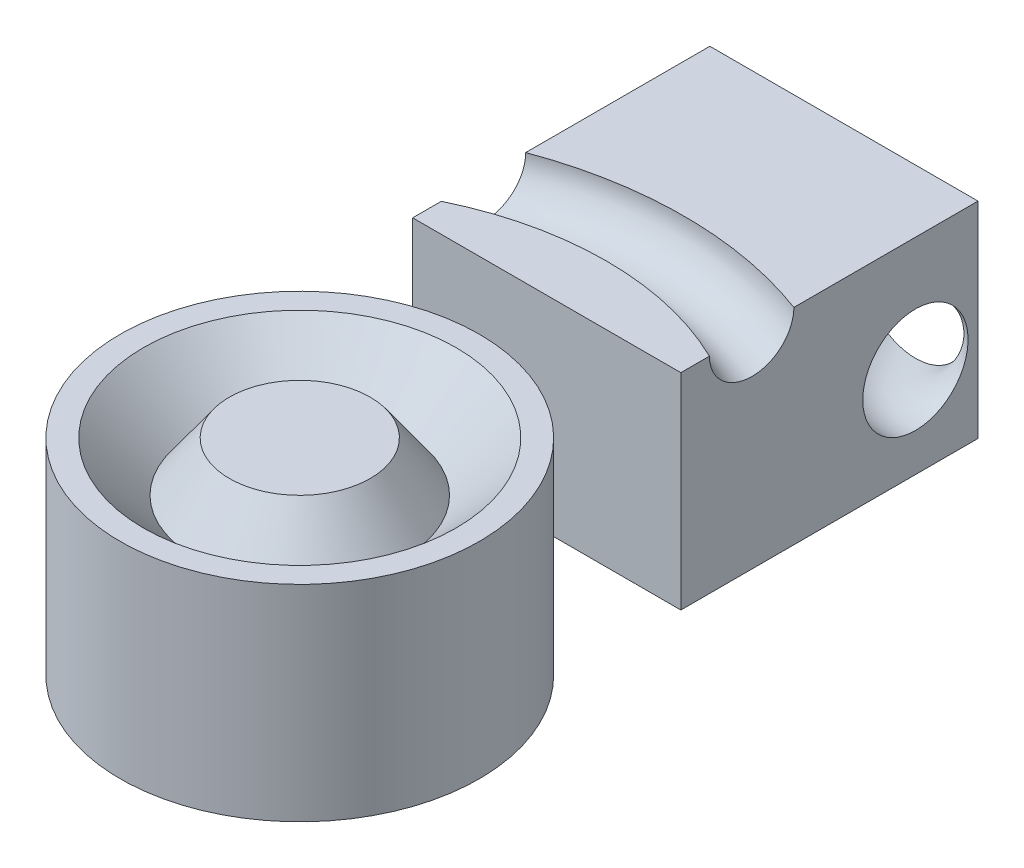
ISO-10303-21;
HEADER;
FILE_DESCRIPTION(('STEP AP214'),'2;1');
FILE_NAME('part.step','',(''),(''),'','','');
FILE_SCHEMA(('AUTOMOTIVE_DESIGN { 1 0 10303 214 1 1 1 1 }'));
ENDSEC;
DATA;
#1=APPLICATION_CONTEXT('core data for automotive mechanical design processes');
#2=APPLICATION_PROTOCOL_DEFINITION('international standard','automotive_design',2000,#1);
#3=PRODUCT_CONTEXT('',#1,'mechanical');
#4=PRODUCT('Part','Part','',(#3));
#5=PRODUCT_RELATED_PRODUCT_CATEGORY('part','',(#4));
#6=PRODUCT_DEFINITION_FORMATION('','',#4);
#7=PRODUCT_DEFINITION_CONTEXT('part definition',#1,'design');
#8=PRODUCT_DEFINITION('design','',#6,#7);
#9=PRODUCT_DEFINITION_SHAPE('','',#8);
#10=(LENGTH_UNIT() NAMED_UNIT(*) SI_UNIT(.MILLI.,.METRE.));
#11=(NAMED_UNIT(*) PLANE_ANGLE_UNIT() SI_UNIT($,.RADIAN.));
#12=(NAMED_UNIT(*) SI_UNIT($,.STERADIAN.) SOLID_ANGLE_UNIT());
#13=UNCERTAINTY_MEASURE_WITH_UNIT(LENGTH_MEASURE(1.E-05),#10,'distance_accuracy_value','');
#14=(GEOMETRIC_REPRESENTATION_CONTEXT(3) GLOBAL_UNCERTAINTY_ASSIGNED_CONTEXT((#13)) GLOBAL_UNIT_ASSIGNED_CONTEXT((#10,
#11,#12)) REPRESENTATION_CONTEXT('',''));
#15=CARTESIAN_POINT('',(0.,0.,0.));
#16=DIRECTION('',(0.,0.,1.));
#17=DIRECTION('',(1.,0.,0.));
#18=AXIS2_PLACEMENT_3D('',#15,#16,#17);
#19=CARTESIAN_POINT('',(0.,67.2092550326107,0.));
#20=DIRECTION('',(0.,1.,0.));
#21=DIRECTION('',(0.,0.,1.));
#22=AXIS2_PLACEMENT_3D('',#19,#20,#21);
#23=PLANE('',#22);
#24=CARTESIAN_POINT('',(0.,67.2092550326107,0.));
#25=DIRECTION('',(0.,1.,0.));
#26=DIRECTION('',(0.,0.,1.));
#27=AXIS2_PLACEMENT_3D('',#24,#25,#26);
#28=CIRCLE('',#27,125.577766247815);
#29=CARTESIAN_POINT('',(43.830339722009,67.2092550326387,-117.680400643625));
#30=VERTEX_POINT('',#29);
#31=CARTESIAN_POINT('',(-43.830339722009,67.2092550325985,-117.680400643625));
#32=VERTEX_POINT('',#31);
#33=EDGE_CURVE('E12',#30,#32,#28,.T.);
#34=ORIENTED_EDGE('',*,*,#33,.F.);
#35=DIRECTION('',(0.,0.,-1.));
#36=VECTOR('',#35,1.);
#37=CARTESIAN_POINT('',(43.830339722009,67.2092550326107,-177.866757769681));
#38=LINE('',#37,#36);
#39=CARTESIAN_POINT('',(43.830339722009,67.2092550326107,-177.866757769681));
#40=VERTEX_POINT('',#39);
#41=EDGE_CURVE('E109',#30,#40,#38,.T.);
#42=ORIENTED_EDGE('',*,*,#41,.T.);
#43=DIRECTION('',(-1.,0.,0.));
#44=VECTOR('',#43,1.);
#45=CARTESIAN_POINT('',(-43.830339722009,67.2092550326107,-177.866757769681));
#46=LINE('',#45,#44);
#47=CARTESIAN_POINT('',(-43.830339722009,67.2092550326107,-177.866757769681));
#48=VERTEX_POINT('',#47);
#49=EDGE_CURVE('E126',#40,#48,#46,.T.);
#50=ORIENTED_EDGE('',*,*,#49,.T.);
#51=DIRECTION('',(0.,0.,1.));
#52=VECTOR('',#51,1.);
#53=CARTESIAN_POINT('',(-43.830339722009,67.2092550326107,-177.866757769681));
#54=LINE('',#53,#52);
#55=EDGE_CURVE('E122',#48,#32,#54,.T.);
#56=ORIENTED_EDGE('',*,*,#55,.T.);
#57=EDGE_LOOP('',(#34,#42,#50,#56));
#58=FACE_BOUND('',#57,.T.);
#59=ADVANCED_FACE('F45',(#58),#23,.T.);
#60=CARTESIAN_POINT('',(0.,67.2092550326107,0.));
#61=DIRECTION('',(0.,-1.,0.));
#62=DIRECTION('',(0.,0.,-1.));
#63=AXIS2_PLACEMENT_3D('',#60,#61,#62);
#64=CIRCLE('',#63,100.177766247815);
#65=CARTESIAN_POINT('',(-43.830339722009,67.2092550326107,-90.0804427734184));
#66=VERTEX_POINT('',#65);
#67=CARTESIAN_POINT('',(43.830339722009,67.2092550326107,-90.0804427734184));
#68=VERTEX_POINT('',#67);
#69=EDGE_CURVE('E53',#66,#68,#64,.T.);
#70=ORIENTED_EDGE('',*,*,#69,.F.);
#71=CARTESIAN_POINT('',(-43.830339722009,67.2092550326107,-80.7292481154995));
#72=VERTEX_POINT('',#71);
#73=EDGE_CURVE('E125',#66,#72,#54,.T.);
#74=ORIENTED_EDGE('',*,*,#73,.T.);
#75=DIRECTION('',(1.,0.,0.));
#76=VECTOR('',#75,1.);
#77=CARTESIAN_POINT('',(-43.830339722009,67.2092550326107,-80.7292481154995));
#78=LINE('',#77,#76);
#79=CARTESIAN_POINT('',(43.830339722009,67.2092550326107,-80.7292481154995));
#80=VERTEX_POINT('',#79);
#81=EDGE_CURVE('E115',#72,#80,#78,.T.);
#82=ORIENTED_EDGE('',*,*,#81,.T.);
#83=EDGE_CURVE('E102',#80,#68,#38,.T.);
#84=ORIENTED_EDGE('',*,*,#83,.T.);
#85=EDGE_LOOP('',(#70,#74,#82,#84));
#86=FACE_BOUND('',#85,.T.);
#87=ADVANCED_FACE('F113',(#86),#23,.T.);
#88=CARTESIAN_POINT('',(-43.830339722009,198.053018744922,-177.866757769681));
#89=DIRECTION('',(1.,0.,0.));
#90=DIRECTION('',(0.,0.,-1.));
#91=AXIS2_PLACEMENT_3D('',#88,#89,#90);
#92=PLANE('',#91);
#93=ORIENTED_EDGE('',*,*,#73,.F.);
#94=CARTESIAN_POINT('',(-43.830339722009,62.3654781087965,-116.655438681486));
#95=CARTESIAN_POINT('',(-43.830339722009,62.6737501623768,-116.791315091685));
#96=CARTESIAN_POINT('',(-43.830339722009,62.9875846408763,-116.914416867969));
#97=CARTESIAN_POINT('',(-43.830339722009,63.6245142100591,-117.134078262891));
#98=CARTESIAN_POINT('',(-43.830339722009,63.9476109133105,-117.230633228313));
#99=CARTESIAN_POINT('',(-43.830339722009,64.6010106056685,-117.396321032733));
#100=CARTESIAN_POINT('',(-43.830339722009,64.9313187341701,-117.465433593375));
#101=CARTESIAN_POINT('',(-43.830339722009,65.5965857762175,-117.575488951459));
#102=CARTESIAN_POINT('',(-43.830339722009,65.9315444796048,-117.616433017629));
#103=CARTESIAN_POINT('',(-43.830339722009,66.6038015101871,-117.669770189495));
#104=CARTESIAN_POINT('',(-43.830339722009,66.9411003275327,-117.682157120809));
#105=CARTESIAN_POINT('',(-43.830339722009,67.6155354862185,-117.678243394372));
#106=CARTESIAN_POINT('',(-43.830339722009,67.9526718256133,-117.661942401284));
#107=CARTESIAN_POINT('',(-43.830339722009,68.6242868700484,-117.600813866798));
#108=CARTESIAN_POINT('',(-43.830339722009,68.9587660274384,-117.555991290956));
#109=CARTESIAN_POINT('',(-43.830339722009,69.6227372271942,-117.438250960461));
#110=CARTESIAN_POINT('',(-43.830339722009,69.9522292933687,-117.365333339979));
#111=CARTESIAN_POINT('',(-43.830339722009,70.6020822015679,-117.19257606628));
#112=CARTESIAN_POINT('',(-43.830339722009,70.9224840453615,-117.092890484052));
#113=CARTESIAN_POINT('',(-43.830339722009,71.5539202543006,-116.867322911524));
#114=CARTESIAN_POINT('',(-43.830339722009,71.8649546820703,-116.741441096399));
#115=CARTESIAN_POINT('',(-43.830339722009,72.475659298627,-116.464585197504));
#116=CARTESIAN_POINT('',(-43.830339722009,72.7753288835554,-116.313609782701));
#117=CARTESIAN_POINT('',(-43.830339722009,73.3614363213731,-115.987860475621));
#118=CARTESIAN_POINT('',(-43.830339722009,73.64787390166,-115.813086093337));
#119=CARTESIAN_POINT('',(-43.830339722009,74.2131396541058,-115.436307525788));
#120=CARTESIAN_POINT('',(-43.830339722009,74.4915726171075,-115.233710515125));
#121=CARTESIAN_POINT('',(-43.830339722009,75.0311194419407,-114.806651441656));
#122=CARTESIAN_POINT('',(-43.830339722009,75.2922330943353,-114.582189114519));
#123=CARTESIAN_POINT('',(-43.830339722009,75.7957644669222,-114.113147545713));
#124=CARTESIAN_POINT('',(-43.830339722009,76.038179934933,-113.868565887994));
#125=CARTESIAN_POINT('',(-43.830339722009,76.5030891074201,-113.36113580405));
#126=CARTESIAN_POINT('',(-43.830339722009,76.7255812780895,-113.098285974201));
#127=CARTESIAN_POINT('',(-43.830339722009,77.1611885970611,-112.541410400662));
#128=CARTESIAN_POINT('',(-43.830339722009,77.3731299457976,-112.246466157999));
#129=CARTESIAN_POINT('',(-43.830339722009,77.7727415896236,-111.640578640627));
#130=CARTESIAN_POINT('',(-43.830339722009,77.9604111321425,-111.329634870255));
#131=CARTESIAN_POINT('',(-43.830339722009,78.3107460409845,-110.693897863466));
#132=CARTESIAN_POINT('',(-43.830339722009,78.4734064837379,-110.369101915991));
#133=CARTESIAN_POINT('',(-43.830339722009,78.7731031436349,-109.707891093557));
#134=CARTESIAN_POINT('',(-43.830339722009,78.9101378569616,-109.371475538085));
#135=CARTESIAN_POINT('',(-43.830339722009,79.1665597110672,-108.666053803759));
#136=CARTESIAN_POINT('',(-43.830339722009,79.2841224404333,-108.296383703432));
#137=CARTESIAN_POINT('',(-43.830339722009,79.4892085232522,-107.548805075625));
#138=CARTESIAN_POINT('',(-43.830339722009,79.5767306393706,-107.170896209483));
#139=CARTESIAN_POINT('',(-43.830339722009,79.7215723416836,-106.409247091362));
#140=CARTESIAN_POINT('',(-43.830339722009,79.7788847228402,-106.0255054707));
#141=CARTESIAN_POINT('',(-43.830339722009,79.8632312715798,-105.254707402569));
#142=CARTESIAN_POINT('',(-43.830339722009,79.8902643019442,-104.867650831148));
#143=CARTESIAN_POINT('',(-43.830339722009,79.9148269513406,-104.069437881568));
#144=CARTESIAN_POINT('',(-43.830339722009,79.9104972494373,-103.658223344263));
#145=CARTESIAN_POINT('',(-43.830339722009,79.8680963791463,-102.83752992716));
#146=CARTESIAN_POINT('',(-43.830339722009,79.830023817738,-102.428051119719));
#147=CARTESIAN_POINT('',(-43.830339722009,79.7204254940984,-101.613494949557));
#148=CARTESIAN_POINT('',(-43.830339722009,79.648891931566,-101.20841863567));
#149=CARTESIAN_POINT('',(-43.830339722009,79.4727708569243,-100.405516550569));
#150=CARTESIAN_POINT('',(-43.830339722009,79.3681834062323,-100.007690765885));
#151=CARTESIAN_POINT('',(-43.830339722009,79.1233300536729,-99.2118997616383));
#152=CARTESIAN_POINT('',(-43.830339722009,78.9822130510467,-98.8141958977279));
#153=CARTESIAN_POINT('',(-43.830339722009,78.6664492102763,-98.0325242884796));
#154=CARTESIAN_POINT('',(-43.830339722009,78.4918173622695,-97.6485504928569));
#155=CARTESIAN_POINT('',(-43.830339722009,78.1097277210785,-96.8971352668598));
#156=CARTESIAN_POINT('',(-43.830339722009,77.9022602918242,-96.5296987303623));
#157=CARTESIAN_POINT('',(-43.830339722009,77.4555234467517,-95.8146839012047));
#158=CARTESIAN_POINT('',(-43.830339722009,77.2162554010904,-95.4671047538941));
#159=CARTESIAN_POINT('',(-43.830339722009,76.7152261679655,-94.8057803833888));
#160=CARTESIAN_POINT('',(-43.830339722009,76.4544214748688,-94.4913109591898));
#161=CARTESIAN_POINT('',(-43.830339722009,75.9055263752494,-93.8871839386573));
#162=CARTESIAN_POINT('',(-43.830339722009,75.6174392754682,-93.5975233434743));
#163=CARTESIAN_POINT('',(-43.830339722009,75.0157634105107,-93.0462333347657));
#164=CARTESIAN_POINT('',(-43.830339722009,74.7021848408249,-92.7845928105043));
#165=CARTESIAN_POINT('',(-43.830339722009,74.0515147659042,-92.2923825744069));
#166=CARTESIAN_POINT('',(-43.830339722009,73.7144257216013,-92.0618096179946));
#167=CARTESIAN_POINT('',(-43.830339722009,73.0496366724729,-91.6534560246554));
#168=CARTESIAN_POINT('',(-43.830339722009,72.723686733356,-91.4728237105016));
#169=CARTESIAN_POINT('',(-43.830339722009,72.0565856536417,-91.1421946018289));
#170=CARTESIAN_POINT('',(-43.830339722009,71.715435328137,-90.9921961670277));
#171=CARTESIAN_POINT('',(-43.830339722009,71.0207829729388,-90.7249032002057));
#172=CARTESIAN_POINT('',(-43.830339722009,70.6672887964127,-90.6075882866085));
#173=CARTESIAN_POINT('',(-43.830339722009,69.9507233854093,-90.4072070609311));
#174=CARTESIAN_POINT('',(-43.830339722009,69.5876529836631,-90.3241377812919));
#175=CARTESIAN_POINT('',(-43.830339722009,68.8904411411097,-90.1997618234962));
#176=CARTESIAN_POINT('',(-43.830339722009,68.5568757055642,-90.1552069992879));
#177=CARTESIAN_POINT('',(-43.830339722009,67.8871280368374,-90.0956304260972));
#178=CARTESIAN_POINT('',(-43.830339722009,67.5509460009002,-90.0806064722611));
#179=CARTESIAN_POINT('',(-43.830339722009,66.8786544150631,-90.0802817689207));
#180=CARTESIAN_POINT('',(-43.830339722009,66.5425448677727,-90.0949736776087));
#181=CARTESIAN_POINT('',(-43.830339722009,65.8729250803415,-90.1538774779507));
#182=CARTESIAN_POINT('',(-43.830339722009,65.5394148174216,-90.1980891106115));
#183=CARTESIAN_POINT('',(-43.830339722009,64.891621314746,-90.3129733457334));
#184=CARTESIAN_POINT('',(-43.830339722009,64.5771234113721,-90.3824412282892));
#185=CARTESIAN_POINT('',(-43.830339722009,63.9549672738711,-90.5471411641566));
#186=CARTESIAN_POINT('',(-43.830339722009,63.6473087721961,-90.642372207723));
#187=CARTESIAN_POINT('',(-43.830339722009,63.040770676794,-90.8575820627858));
#188=CARTESIAN_POINT('',(-43.830339722009,62.7418914695646,-90.9775619619603));
#189=CARTESIAN_POINT('',(-43.830339722009,62.1546960236767,-91.2410511808492));
#190=CARTESIAN_POINT('',(-43.830339722009,61.8663801487291,-91.3845613098138));
#191=CARTESIAN_POINT('',(-43.830339722009,61.2925596860065,-91.6988633906055));
#192=CARTESIAN_POINT('',(-43.830339722009,61.0074635899256,-91.8704007792151));
#193=CARTESIAN_POINT('',(-43.830339722009,60.4517696066199,-92.2355146434365));
#194=CARTESIAN_POINT('',(-43.830339722009,60.1811719148162,-92.4290914160028));
#195=CARTESIAN_POINT('',(-43.830339722009,59.6557333019631,-92.836643519177));
#196=CARTESIAN_POINT('',(-43.830339722009,59.4008954613713,-93.0506228170652));
#197=CARTESIAN_POINT('',(-43.830339722009,58.9081312833858,-93.4972548759866));
#198=CARTESIAN_POINT('',(-43.830339722009,58.6702065034603,-93.7299093525662));
#199=CARTESIAN_POINT('',(-43.830339722009,58.1929976815068,-94.2324312140318));
#200=CARTESIAN_POINT('',(-43.830339722009,57.9552757859654,-94.5037829922723));
#201=CARTESIAN_POINT('',(-43.830339722009,57.5018342086851,-95.0642775109035));
#202=CARTESIAN_POINT('',(-43.830339722009,57.2861155723024,-95.3534210955225));
#203=CARTESIAN_POINT('',(-43.830339722009,56.8774865546602,-95.9474486964157));
#204=CARTESIAN_POINT('',(-43.830339722009,56.6845794680662,-96.2523349772898));
#205=CARTESIAN_POINT('',(-43.830339722009,56.3222416530642,-96.8758763331014));
#206=CARTESIAN_POINT('',(-43.830339722009,56.1528193125543,-97.1945362744563));
#207=CARTESIAN_POINT('',(-43.830339722009,55.8236569272458,-97.8733561686727));
#208=CARTESIAN_POINT('',(-43.830339722009,55.6662325877731,-98.2346407706323));
#209=CARTESIAN_POINT('',(-43.830339722009,55.3807254147927,-98.9687919167965));
#210=CARTESIAN_POINT('',(-43.830339722009,55.2526558951041,-99.3416636295929));
#211=CARTESIAN_POINT('',(-43.830339722009,55.0264598080137,-100.096410379493));
#212=CARTESIAN_POINT('',(-43.830339722009,54.9283355909627,-100.478286120774));
#213=CARTESIAN_POINT('',(-43.830339722009,54.762476951659,-101.248584283822));
#214=CARTESIAN_POINT('',(-43.830339722009,54.6947435070014,-101.637006915771));
#215=CARTESIAN_POINT('',(-43.830339722009,54.5869000774847,-102.441261336598));
#216=CARTESIAN_POINT('',(-43.830339722009,54.5486763443195,-102.857347345654));
#217=CARTESIAN_POINT('',(-43.830339722009,54.5070661476149,-103.691260034686));
#218=CARTESIAN_POINT('',(-43.830339722009,54.5036801455163,-104.109086737645));
#219=CARTESIAN_POINT('',(-43.830339722009,54.5319498905673,-104.943614076105));
#220=CARTESIAN_POINT('',(-43.830339722009,54.563610031264,-105.360314563853));
#221=CARTESIAN_POINT('',(-43.830339722009,54.662051033196,-106.189538075112));
#222=CARTESIAN_POINT('',(-43.830339722009,54.7288304534646,-106.602061269311));
#223=CARTESIAN_POINT('',(-43.830339722009,54.8977829317538,-107.421611364558));
#224=CARTESIAN_POINT('',(-43.830339722009,55.000103000665,-107.828608023665));
#225=CARTESIAN_POINT('',(-43.830339722009,55.2397631661824,-108.631997984574));
#226=CARTESIAN_POINT('',(-43.830339722009,55.3770893857203,-109.028395419459));
#227=CARTESIAN_POINT('',(-43.830339722009,55.686344791017,-109.807636318507));
#228=CARTESIAN_POINT('',(-43.830339722009,55.8582862270789,-110.190474927648));
#229=CARTESIAN_POINT('',(-43.830339722009,56.2359772905873,-110.939093235609));
#230=CARTESIAN_POINT('',(-43.830339722009,56.4417245379393,-111.304874133049));
#231=CARTESIAN_POINT('',(-43.830339722009,56.8757249158733,-111.999614364209));
#232=CARTESIAN_POINT('',(-43.830339722009,57.1025054887693,-112.329493643985));
#233=CARTESIAN_POINT('',(-43.830339722009,57.5846177775398,-112.967664831994));
#234=CARTESIAN_POINT('',(-43.830339722009,57.8399467269621,-113.275958827227));
#235=CARTESIAN_POINT('',(-43.830339722009,58.3772179098158,-113.867585848925));
#236=CARTESIAN_POINT('',(-43.830339722009,58.6591187688387,-114.150956395172));
#237=CARTESIAN_POINT('',(-43.830339722009,59.2478380446248,-114.690275690503));
#238=CARTESIAN_POINT('',(-43.830339722009,59.5546473529921,-114.946234384717));
#239=CARTESIAN_POINT('',(-43.830339722009,60.2581094946282,-115.478880469141));
#240=CARTESIAN_POINT('',(-43.830339722009,60.6600799757044,-115.74859050376));
#241=CARTESIAN_POINT('',(-43.830339722009,61.4927140937406,-116.239435843518));
#242=CARTESIAN_POINT('',(-43.830339722009,61.9233759011532,-116.460574242048));
#243=CARTESIAN_POINT('',(-43.830339722009,62.3654781087965,-116.655438681486));
#244=B_SPLINE_CURVE_WITH_KNOTS('',3,(#94,#95,#96,#97,#98,#99,#100,#101,#102,#103,#104,#105,#106,
#107,#108,#109,#110,#111,#112,#113,#114,#115,#116,#117,#118,#119,#120,#121,#122,#123,#124,#125,
#126,#127,#128,#129,#130,#131,#132,#133,#134,#135,#136,#137,#138,#139,#140,#141,#142,#143,#144,
#145,#146,#147,#148,#149,#150,#151,#152,#153,#154,#155,#156,#157,#158,#159,#160,#161,#162,#163,
#164,#165,#166,#167,#168,#169,#170,#171,#172,#173,#174,#175,#176,#177,#178,#179,#180,#181,#182,
#183,#184,#185,#186,#187,#188,#189,#190,#191,#192,#193,#194,#195,#196,#197,#198,#199,#200,#201,
#202,#203,#204,#205,#206,#207,#208,#209,#210,#211,#212,#213,#214,#215,#216,#217,#218,#219,#220,
#221,#222,#223,#224,#225,#226,#227,#228,#229,#230,#231,#232,#233,#234,#235,#236,#237,#238,#239,
#240,#241,#242,#243),.UNSPECIFIED.,.T.,.F.,(4,2,2,2,2,2,2,2,2,2,2,2,2,2,2,2,2,2,2,2,2,2,2,2,2,2,
2,2,2,2,2,2,2,2,2,2,2,2,2,2,2,2,2,2,2,2,2,2,2,2,2,2,2,2,2,2,2,2,2,2,2,2,2,2,2,2,2,2,2,2,2,2,2,2,
4),(0.,1.01026473478604,2.02070643944717,3.03189341895522,4.0430348509173,5.0543948827788,
6.06576673663446,7.07696256060011,8.08815355555044,9.09364466809796,10.0991290571196,
11.1046667968317,12.1102252431346,13.1420946493037,14.1739765312658,15.2059825091144,
16.2380678683697,17.3264600007482,18.4148858716827,19.5035257486241,20.5922294911241,
21.7546866133527,22.9171916099597,24.0799737393203,25.2427995384828,26.4751035574852,
27.7074584525759,28.940100772825,30.1727408027179,31.4371916691993,32.7010782990317,
33.9653365245338,35.2295402960338,36.453567364687,37.6774462655704,38.9008380534511,
40.1241019758375,41.2405582550769,42.3569547382946,43.4726534657993,44.588255491981,
45.5965650121879,46.6047992464516,47.6127844097795,48.6207607296027,49.5858890022896,
50.550979453824,51.5161123287924,52.481278403511,53.478371915032,54.4754788627926,
55.4727800954074,56.470173047565,57.5512831087876,58.6324445087361,59.7137618702947,
60.7954644494664,61.9764436635928,63.1579574532239,64.3395639538232,65.5212084610176,
66.7732555921151,68.0253193070943,69.2775400043646,70.5297093262192,71.7871210653875,
73.0440351169771,74.3013947740871,75.5586659448331,76.7580442172343,77.9573063656366,
79.1547310870854,80.351719895688,81.8006631900396,83.2495141785279),.UNSPECIFIED.);
#245=EDGE_CURVE('E59',#66,#32,#244,.T.);
#246=ORIENTED_EDGE('',*,*,#245,.T.);
#247=ORIENTED_EDGE('',*,*,#55,.F.);
#248=DIRECTION('',(0.,-1.,0.));
#249=VECTOR('',#248,1.);
#250=CARTESIAN_POINT('',(-43.830339722009,198.053018744922,-177.866757769681));
#251=LINE('',#250,#249);
#252=CARTESIAN_POINT('',(-43.830339722009,0.,-177.866757769681));
#253=VERTEX_POINT('',#252);
#254=EDGE_CURVE('E67',#48,#253,#251,.T.);
#255=ORIENTED_EDGE('',*,*,#254,.T.);
#256=DIRECTION('',(0.,0.,1.));
#257=VECTOR('',#256,1.);
#258=CARTESIAN_POINT('',(-43.830339722009,0.,-177.866757769681));
#259=LINE('',#258,#257);
#260=CARTESIAN_POINT('',(-43.830339722009,0.,-80.7292481154995));
#261=VERTEX_POINT('',#260);
#262=EDGE_CURVE('E119',#253,#261,#259,.T.);
#263=ORIENTED_EDGE('',*,*,#262,.T.);
#264=DIRECTION('',(0.,-1.,0.));
#265=VECTOR('',#264,1.);
#266=CARTESIAN_POINT('',(-43.830339722009,198.053018744922,-80.7292481154995));
#267=LINE('',#266,#265);
#268=EDGE_CURVE('E130',#72,#261,#267,.T.);
#269=ORIENTED_EDGE('',*,*,#268,.F.);
#270=EDGE_LOOP('',(#93,#246,#247,#255,#263,#269));
#271=FACE_BOUND('',#270,.T.);
#272=ADVANCED_FACE('F150',(#271),#92,.F.);
#273=CARTESIAN_POINT('',(-43.830339722009,198.053018744922,-80.7292481154995));
#274=DIRECTION('',(0.,0.,-1.));
#275=DIRECTION('',(-1.,0.,0.));
#276=AXIS2_PLACEMENT_3D('',#273,#274,#275);
#277=PLANE('',#276);
#278=ORIENTED_EDGE('',*,*,#81,.F.);
#279=ORIENTED_EDGE('',*,*,#268,.T.);
#280=DIRECTION('',(1.,0.,0.));
#281=VECTOR('',#280,1.);
#282=CARTESIAN_POINT('',(-43.830339722009,0.,-80.7292481154995));
#283=LINE('',#282,#281);
#284=CARTESIAN_POINT('',(43.830339722009,0.,-80.7292481154995));
#285=VERTEX_POINT('',#284);
#286=EDGE_CURVE('E132',#261,#285,#283,.T.);
#287=ORIENTED_EDGE('',*,*,#286,.T.);
#288=DIRECTION('',(0.,-1.,0.));
#289=VECTOR('',#288,1.);
#290=CARTESIAN_POINT('',(43.830339722009,198.053018744922,-80.7292481154995));
#291=LINE('',#290,#289);
#292=EDGE_CURVE('E133',#80,#285,#291,.T.);
#293=ORIENTED_EDGE('',*,*,#292,.F.);
#294=EDGE_LOOP('',(#278,#279,#287,#293));
#295=FACE_BOUND('',#294,.T.);
#296=ADVANCED_FACE('F168',(#295),#277,.F.);
#297=CARTESIAN_POINT('',(43.830339722009,198.053018744922,-177.866757769681));
#298=DIRECTION('',(-1.,0.,0.));
#299=DIRECTION('',(0.,0.,1.));
#300=AXIS2_PLACEMENT_3D('',#297,#298,#299);
#301=PLANE('',#300);
#302=CARTESIAN_POINT('',(43.830339722009,29.6850412683125,-157.413072148828));
#303=DIRECTION('',(-1.,0.,0.));
#304=DIRECTION('',(0.,0.,1.));
#305=AXIS2_PLACEMENT_3D('',#302,#303,#304);
#306=CIRCLE('',#305,17.2073867052345);
#307=CARTESIAN_POINT('',(43.830339722009,29.6850412683125,-140.205685443594));
#308=VERTEX_POINT('',#307);
#309=EDGE_CURVE('E110',#308,#308,#306,.T.);
#310=ORIENTED_EDGE('',*,*,#309,.T.);
#311=EDGE_LOOP('',(#310));
#312=FACE_BOUND('',#311,.T.);
#313=ORIENTED_EDGE('',*,*,#41,.F.);
#314=CARTESIAN_POINT('',(43.830339722009,62.3654781087965,-116.655438681486));
#315=CARTESIAN_POINT('',(43.830339722009,62.0370732044306,-116.510694223581));
#316=CARTESIAN_POINT('',(43.830339722009,61.7150382903043,-116.351484685831));
#317=CARTESIAN_POINT('',(43.830339722009,61.0858961464256,-116.005636291331));
#318=CARTESIAN_POINT('',(43.830339722009,60.7787951839974,-115.818986048524));
#319=CARTESIAN_POINT('',(43.830339722009,60.1812447318529,-115.419746271616));
#320=CARTESIAN_POINT('',(43.830339722009,59.8908227394371,-115.20711561366));
#321=CARTESIAN_POINT('',(43.830339722009,59.3289810443124,-114.758063863977));
#322=CARTESIAN_POINT('',(43.830339722009,59.0575625794375,-114.521641224951));
#323=CARTESIAN_POINT('',(43.830339722009,58.5361798327339,-114.02785309907));
#324=CARTESIAN_POINT('',(43.830339722009,58.2861491058438,-113.77055770107));
#325=CARTESIAN_POINT('',(43.830339722009,57.807895614776,-113.236449427761));
#326=CARTESIAN_POINT('',(43.830339722009,57.5796732256012,-112.959636216978));
#327=CARTESIAN_POINT('',(43.830339722009,57.1462277856533,-112.388724963595));
#328=CARTESIAN_POINT('',(43.830339722009,56.9409965298764,-112.094633144819));
#329=CARTESIAN_POINT('',(43.830339722009,56.5543287162628,-111.491198763147));
#330=CARTESIAN_POINT('',(43.830339722009,56.3728934475657,-111.18185537525));
#331=CARTESIAN_POINT('',(43.830339722009,56.026286314543,-110.534646694394));
#332=CARTESIAN_POINT('',(43.830339722009,55.8623377624084,-110.196126097787));
#333=CARTESIAN_POINT('',(43.830339722009,55.5620157383459,-109.507074759534));
#334=CARTESIAN_POINT('',(43.830339722009,55.4256430099211,-109.156543694358));
#335=CARTESIAN_POINT('',(43.830339722009,55.1808718316786,-108.44574554525));
#336=CARTESIAN_POINT('',(43.830339722009,55.0724812642834,-108.085475749476));
#337=CARTESIAN_POINT('',(43.830339722009,54.8839964602768,-107.357606268121));
#338=CARTESIAN_POINT('',(43.830339722009,54.8039035800694,-106.99000623207));
#339=CARTESIAN_POINT('',(43.830339722009,54.6677525892382,-106.224971669148));
#340=CARTESIAN_POINT('',(43.830339722009,54.6136606270696,-105.827186314433));
#341=CARTESIAN_POINT('',(43.830339722009,54.5378839683672,-105.028538618682));
#342=CARTESIAN_POINT('',(43.830339722009,54.5162006369865,-104.627676148744));
#343=CARTESIAN_POINT('',(43.830339722009,54.5051466029497,-103.825478980892));
#344=CARTESIAN_POINT('',(43.830339722009,54.5157782439272,-103.424144250839));
#345=CARTESIAN_POINT('',(43.830339722009,54.5691651406777,-102.623478635695));
#346=CARTESIAN_POINT('',(43.830339722009,54.611931978629,-102.224148525361));
#347=CARTESIAN_POINT('',(43.830339722009,54.7318960433892,-101.41268200633));
#348=CARTESIAN_POINT('',(43.830339722009,54.8105276454157,-101.000756853424));
#349=CARTESIAN_POINT('',(43.830339722009,55.0021056180905,-100.184756126673));
#350=CARTESIAN_POINT('',(43.830339722009,55.1150684065703,-99.7806844070723));
#351=CARTESIAN_POINT('',(43.830339722009,55.3747706001899,-98.9834475477886));
#352=CARTESIAN_POINT('',(43.830339722009,55.5215165096201,-98.5902845247199));
#353=CARTESIAN_POINT('',(43.830339722009,55.848018849887,-97.818130741088));
#354=CARTESIAN_POINT('',(43.830339722009,56.0277586319021,-97.4391329482752));
#355=CARTESIAN_POINT('',(43.830339722009,56.4188281850567,-96.6993950956126));
#356=CARTESIAN_POINT('',(43.830339722009,56.6300508735319,-96.3385984906275));
#357=CARTESIAN_POINT('',(43.830339722009,57.0834369650845,-95.6371910044276));
#358=CARTESIAN_POINT('',(43.830339722009,57.3255869622723,-95.2965714702612));
#359=CARTESIAN_POINT('',(43.830339722009,57.8396818196251,-94.6385657599051));
#360=CARTESIAN_POINT('',(43.830339722009,58.1116273826392,-94.321180132076));
#361=CARTESIAN_POINT('',(43.830339722009,58.6837816710574,-93.7129838523853));
#362=CARTESIAN_POINT('',(43.830339722009,58.9839881287065,-93.4221710719078));
#363=CARTESIAN_POINT('',(43.830339722009,59.5903757221589,-92.8884402227993));
#364=CARTESIAN_POINT('',(43.830339722009,59.8948978655793,-92.6436371747763));
#365=CARTESIAN_POINT('',(43.830339722009,60.5250789181823,-92.182975978712));
#366=CARTESIAN_POINT('',(43.830339722009,60.8507347626817,-91.9671136477183));
#367=CARTESIAN_POINT('',(43.830339722009,61.5207394309094,-91.5671018996346));
#368=CARTESIAN_POINT('',(43.830339722009,61.8650770889673,-91.3829338083961));
#369=CARTESIAN_POINT('',(43.830339722009,62.5699157866707,-91.0486745724152));
#370=CARTESIAN_POINT('',(43.830339722009,62.9304150677846,-90.8985797309176));
#371=CARTESIAN_POINT('',(43.830339722009,63.6275966218225,-90.6479182605135));
#372=CARTESIAN_POINT('',(43.830339722009,63.963038588008,-90.5438929202939));
#373=CARTESIAN_POINT('',(43.830339722009,64.6419378412476,-90.3665208374528));
#374=CARTESIAN_POINT('',(43.830339722009,64.9853945460053,-90.2931718733759));
#375=CARTESIAN_POINT('',(43.830339722009,65.6774231869878,-90.1781546733898));
#376=CARTESIAN_POINT('',(43.830339722009,66.0259928379027,-90.1364726983136));
#377=CARTESIAN_POINT('',(43.830339722009,66.7254855697134,-90.0853131158458));
#378=CARTESIAN_POINT('',(43.830339722009,67.0764085473809,-90.0758341050135));
#379=CARTESIAN_POINT('',(43.830339722009,67.7520012436246,-90.0887155819411));
#380=CARTESIAN_POINT('',(43.830339722009,68.0767166228644,-90.1088013754029));
#381=CARTESIAN_POINT('',(43.830339722009,68.7232472191376,-90.1765042086611));
#382=CARTESIAN_POINT('',(43.830339722009,69.0450626109069,-90.2241195782714));
#383=CARTESIAN_POINT('',(43.830339722009,69.683499495297,-90.3463173357948));
#384=CARTESIAN_POINT('',(43.830339722009,70.00012133894,-90.4208978932642));
#385=CARTESIAN_POINT('',(43.830339722009,70.6260467745209,-90.5961798263192));
#386=CARTESIAN_POINT('',(43.830339722009,70.9353502144528,-90.6968817439359));
#387=CARTESIAN_POINT('',(43.830339722009,71.5445220700721,-90.9232677939113));
#388=CARTESIAN_POINT('',(43.830339722009,71.8443941713222,-91.048942023529));
#389=CARTESIAN_POINT('',(43.830339722009,72.4330352659701,-91.3240101249457));
#390=CARTESIAN_POINT('',(43.830339722009,72.7218043643925,-91.4734037723113));
#391=CARTESIAN_POINT('',(43.830339722009,73.2866910091481,-91.7945047795845));
#392=CARTESIAN_POINT('',(43.830339722009,73.5628069350877,-91.9662149866593));
#393=CARTESIAN_POINT('',(43.830339722009,74.1009820393754,-92.3304233645698));
#394=CARTESIAN_POINT('',(43.830339722009,74.3630399844856,-92.5229233547424));
#395=CARTESIAN_POINT('',(43.830339722009,74.8885887436911,-92.9403979525037));
#396=CARTESIAN_POINT('',(43.830339722009,75.1510455260521,-93.1666745635607));
#397=CARTESIAN_POINT('',(43.830339722009,75.6573944199278,-93.639109375883));
#398=CARTESIAN_POINT('',(43.830339722009,75.9012858780411,-93.8852682762721));
#399=CARTESIAN_POINT('',(43.830339722009,76.3695044870789,-94.3955767788362));
#400=CARTESIAN_POINT('',(43.830339722009,76.5938292826003,-94.6597285401651));
#401=CARTESIAN_POINT('',(43.830339722009,77.0220958812871,-95.2041952592045));
#402=CARTESIAN_POINT('',(43.830339722009,77.2260304310131,-95.4845159131658));
#403=CARTESIAN_POINT('',(43.830339722009,77.6308318887185,-96.0863333635882));
#404=CARTESIAN_POINT('',(43.830339722009,77.8296231102983,-96.4092278499258));
#405=CARTESIAN_POINT('',(43.830339722009,78.2011425703303,-97.0698044483132));
#406=CARTESIAN_POINT('',(43.830339722009,78.3738614820163,-97.4074917966961));
#407=CARTESIAN_POINT('',(43.830339722009,78.6925347239082,-98.0953227612024));
#408=CARTESIAN_POINT('',(43.830339722009,78.8384849791935,-98.4454682641267));
#409=CARTESIAN_POINT('',(43.830339722009,79.1030477037639,-99.1559368669414));
#410=CARTESIAN_POINT('',(43.830339722009,79.2216592498018,-99.5162603100869));
#411=CARTESIAN_POINT('',(43.830339722009,79.439346449975,-100.273635610547));
#412=CARTESIAN_POINT('',(43.830339722009,79.5361450076926,-100.671343652828));
#413=CARTESIAN_POINT('',(43.830339722009,79.6968923264598,-101.473218457654));
#414=CARTESIAN_POINT('',(43.830339722009,79.7608501096912,-101.877383414827));
#415=CARTESIAN_POINT('',(43.830339722009,79.8556123083944,-102.689816833801));
#416=CARTESIAN_POINT('',(43.830339722009,79.8863979440771,-103.098087488104));
#417=CARTESIAN_POINT('',(43.830339722009,79.9144686493066,-103.915629677443));
#418=CARTESIAN_POINT('',(43.830339722009,79.911765900853,-104.324900794378));
#419=CARTESIAN_POINT('',(43.830339722009,79.8721192458859,-105.154357950072));
#420=CARTESIAN_POINT('',(43.830339722009,79.8341297355861,-105.57449461302));
#421=CARTESIAN_POINT('',(43.830339722009,79.7223627351012,-106.410001361517));
#422=CARTESIAN_POINT('',(43.830339722009,79.6485841524055,-106.82537130116));
#423=CARTESIAN_POINT('',(43.830339722009,79.4653528580285,-107.64818026749));
#424=CARTESIAN_POINT('',(43.830339722009,79.355900244239,-108.055619315936));
#425=CARTESIAN_POINT('',(43.830339722009,79.1016339967407,-108.859316066802));
#426=CARTESIAN_POINT('',(43.830339722009,78.9568216115997,-109.255574163474));
#427=CARTESIAN_POINT('',(43.830339722009,78.6365845938324,-110.023520714476));
#428=CARTESIAN_POINT('',(43.830339722009,78.4620486405178,-110.39557956817));
#429=CARTESIAN_POINT('',(43.830339722009,78.0807021232409,-111.12279775843));
#430=CARTESIAN_POINT('',(43.830339722009,77.8738916797423,-111.477957158067));
#431=CARTESIAN_POINT('',(43.830339722009,77.4291102200556,-112.168085193815));
#432=CARTESIAN_POINT('',(43.830339722009,77.1911475001298,-112.503059171009));
#433=CARTESIAN_POINT('',(43.830339722009,76.6854075387355,-113.149695594399));
#434=CARTESIAN_POINT('',(43.830339722009,76.4176322670697,-113.461359578481));
#435=CARTESIAN_POINT('',(43.830339722009,75.8720338311389,-114.039127834404));
#436=CARTESIAN_POINT('',(43.830339722009,75.5959447292925,-114.306870603358));
#437=CARTESIAN_POINT('',(43.830339722009,75.0209239049248,-114.816606485185));
#438=CARTESIAN_POINT('',(43.830339722009,74.7219930040596,-115.058600523532));
#439=CARTESIAN_POINT('',(43.830339722009,74.1034792138743,-115.5143161289));
#440=CARTESIAN_POINT('',(43.830339722009,73.7839048099871,-115.728049203785));
#441=CARTESIAN_POINT('',(43.830339722009,73.1263828418089,-116.125093749276));
#442=CARTESIAN_POINT('',(43.830339722009,72.7884364074898,-116.308407088043));
#443=CARTESIAN_POINT('',(43.830339722009,72.1212653567617,-116.630803179724));
#444=CARTESIAN_POINT('',(43.830339722009,71.7931057680312,-116.772093187997));
#445=CARTESIAN_POINT('',(43.830339722009,71.1256250637212,-117.025248603181));
#446=CARTESIAN_POINT('',(43.830339722009,70.7863044411846,-117.13711530792));
#447=CARTESIAN_POINT('',(43.830339722009,70.0990529465598,-117.330285305786));
#448=CARTESIAN_POINT('',(43.830339722009,69.7511217160513,-117.411587324357));
#449=CARTESIAN_POINT('',(43.830339722009,69.0493914569036,-117.542766720996));
#450=CARTESIAN_POINT('',(43.830339722009,68.6955927168808,-117.592645640053));
#451=CARTESIAN_POINT('',(43.830339722009,68.0021082306081,-117.658817738263));
#452=CARTESIAN_POINT('',(43.830339722009,67.6625652000218,-117.676615311046));
#453=CARTESIAN_POINT('',(43.830339722009,66.9832033546319,-117.683101065634));
#454=CARTESIAN_POINT('',(43.830339722009,66.6433845458321,-117.671789865013));
#455=CARTESIAN_POINT('',(43.830339722009,65.9664320814206,-117.6202041865));
#456=CARTESIAN_POINT('',(43.830339722009,65.6292953437065,-117.579970094504));
#457=CARTESIAN_POINT('',(43.830339722009,64.9597823333812,-117.470990984579));
#458=CARTESIAN_POINT('',(43.830339722009,64.6274045005153,-117.40225554331));
#459=CARTESIAN_POINT('',(43.830339722009,63.9677394152057,-117.236445831992));
#460=CARTESIAN_POINT('',(43.830339722009,63.6404930463346,-117.139208964465));
#461=CARTESIAN_POINT('',(43.830339722009,62.9954066875698,-116.917480804648));
#462=CARTESIAN_POINT('',(43.830339722009,62.6775660368448,-116.792991432263));
#463=CARTESIAN_POINT('',(43.830339722009,62.3654781087965,-116.655438681486));
#464=B_SPLINE_CURVE_WITH_KNOTS('',3,(#314,#315,#316,#317,#318,#319,#320,#321,#322,#323,#324,
#325,#326,#327,#328,#329,#330,#331,#332,#333,#334,#335,#336,#337,#338,#339,#340,#341,#342,#343,
#344,#345,#346,#347,#348,#349,#350,#351,#352,#353,#354,#355,#356,#357,#358,#359,#360,#361,#362,
#363,#364,#365,#366,#367,#368,#369,#370,#371,#372,#373,#374,#375,#376,#377,#378,#379,#380,#381,
#382,#383,#384,#385,#386,#387,#388,#389,#390,#391,#392,#393,#394,#395,#396,#397,#398,#399,#400,
#401,#402,#403,#404,#405,#406,#407,#408,#409,#410,#411,#412,#413,#414,#415,#416,#417,#418,#419,
#420,#421,#422,#423,#424,#425,#426,#427,#428,#429,#430,#431,#432,#433,#434,#435,#436,#437,#438,
#439,#440,#441,#442,#443,#444,#445,#446,#447,#448,#449,#450,#451,#452,#453,#454,#455,#456,#457,
#458,#459,#460,#461,#462,#463),.UNSPECIFIED.,.T.,.F.,(4,2,2,2,2,2,2,2,2,2,2,2,2,2,2,2,2,2,2,2,2,
2,2,2,2,2,2,2,2,2,2,2,2,2,2,2,2,2,2,2,2,2,2,2,2,2,2,2,2,2,2,2,2,2,2,2,2,2,2,2,2,2,2,2,2,2,2,2,2,
2,2,2,2,2,4),(0.,1.07633556018699,2.15311899479445,3.23162948160037,4.31021015418504,
5.38530812082379,6.4604245708705,7.53515610613862,8.60994584059796,9.73710874795879,
10.8643020419907,11.9918125146171,13.1193770253119,14.3223677454538,15.5254091379102,
16.7285377826624,17.9321002675579,19.1887072146391,20.4459160433664,21.7033671262088,
22.9601854304732,24.2128225592375,25.4649185454753,26.7170440738306,27.9690692126682,
29.1396496938102,30.3100608020442,31.4797799289474,32.6493720872119,33.7015939472893,
34.7537395966387,35.8054284967507,36.857071562516,37.8319127591021,38.8066948194561,
39.7814107223361,40.7561468526732,41.7304972211602,42.7048383708765,43.6793039501804,
44.6538548752553,45.6923451621796,46.7308719816028,47.7695236451639,48.8085434843288,
49.9448632503319,51.0815885500388,52.218486747015,53.3554233322083,54.5819849221456,
55.8082093644209,57.0351276465174,58.2615996282191,59.5256144333453,60.7896678266909,
62.0537177514239,63.3177230484939,64.5490343741195,65.7803411040204,67.0113205852424,
68.2422187802582,69.3945009744983,70.5467417388017,71.6985118561828,72.8502112139063,
73.9207087386215,74.9911590370466,76.0616539686321,77.1320963990121,78.1508898734237,
79.1696617332542,80.1870138078825,81.2040243215317,82.2269536047824,83.2498108471615),.UNSPECIFIED.);
#465=EDGE_CURVE('E97',#30,#68,#464,.T.);
#466=ORIENTED_EDGE('',*,*,#465,.T.);
#467=ORIENTED_EDGE('',*,*,#83,.F.);
#468=ORIENTED_EDGE('',*,*,#292,.T.);
#469=DIRECTION('',(0.,0.,-1.));
#470=VECTOR('',#469,1.);
#471=CARTESIAN_POINT('',(43.830339722009,0.,-177.866757769681));
#472=LINE('',#471,#470);
#473=CARTESIAN_POINT('',(43.830339722009,0.,-177.866757769681));
#474=VERTEX_POINT('',#473);
#475=EDGE_CURVE('E135',#285,#474,#472,.T.);
#476=ORIENTED_EDGE('',*,*,#475,.T.);
#477=DIRECTION('',(0.,-1.,0.));
#478=VECTOR('',#477,1.);
#479=CARTESIAN_POINT('',(43.830339722009,198.053018744922,-177.866757769681));
#480=LINE('',#479,#478);
#481=EDGE_CURVE('E136',#40,#474,#480,.T.);
#482=ORIENTED_EDGE('',*,*,#481,.F.);
#483=EDGE_LOOP('',(#313,#466,#467,#468,#476,#482));
#484=FACE_BOUND('',#483,.T.);
#485=ADVANCED_FACE('F106',(#312,#484),#301,.F.);
#486=CARTESIAN_POINT('',(-43.830339722009,198.053018744922,-177.866757769681));
#487=DIRECTION('',(0.,0.,1.));
#488=DIRECTION('',(1.,0.,0.));
#489=AXIS2_PLACEMENT_3D('',#486,#487,#488);
#490=PLANE('',#489);
#491=CARTESIAN_POINT('',(23.376654101156,29.6850412683125,-177.866757769681));
#492=DIRECTION('',(0.,0.,1.));
#493=DIRECTION('',(1.,0.,0.));
#494=AXIS2_PLACEMENT_3D('',#491,#492,#493);
#495=CIRCLE('',#494,17.2073867052345);
#496=CARTESIAN_POINT('',(6.16926739592147,29.6850412683125,-177.866757769681));
#497=VERTEX_POINT('',#496);
#498=EDGE_CURVE('E48',#497,#497,#495,.T.);
#499=ORIENTED_EDGE('',*,*,#498,.T.);
#500=EDGE_LOOP('',(#499));
#501=FACE_BOUND('',#500,.T.);
#502=ORIENTED_EDGE('',*,*,#49,.F.);
#503=ORIENTED_EDGE('',*,*,#481,.T.);
#504=DIRECTION('',(-1.,0.,0.));
#505=VECTOR('',#504,1.);
#506=CARTESIAN_POINT('',(-43.830339722009,0.,-177.866757769681));
#507=LINE('',#506,#505);
#508=EDGE_CURVE('E129',#474,#253,#507,.T.);
#509=ORIENTED_EDGE('',*,*,#508,.T.);
#510=ORIENTED_EDGE('',*,*,#254,.F.);
#511=EDGE_LOOP('',(#502,#503,#509,#510));
#512=FACE_BOUND('',#511,.T.);
#513=ADVANCED_FACE('F162',(#501,#512),#490,.F.);
#514=CARTESIAN_POINT('',(0.,0.,0.));
#515=DIRECTION('',(0.,1.,0.));
#516=DIRECTION('',(0.,0.,1.));
#517=AXIS2_PLACEMENT_3D('',#514,#515,#516);
#518=PLANE('',#517);
#519=ORIENTED_EDGE('',*,*,#262,.F.);
#520=ORIENTED_EDGE('',*,*,#508,.F.);
#521=ORIENTED_EDGE('',*,*,#475,.F.);
#522=ORIENTED_EDGE('',*,*,#286,.F.);
#523=EDGE_LOOP('',(#519,#520,#521,#522));
#524=FACE_BOUND('',#523,.T.);
#525=ADVANCED_FACE('F158',(#524),#518,.F.);
#526=CARTESIAN_POINT('',(0.,67.2092550326108,0.));
#527=DIRECTION('',(0.,-1.,0.));
#528=DIRECTION('',(0.,0.,-1.));
#529=AXIS2_PLACEMENT_3D('',#526,#527,#528);
#530=TOROIDAL_SURFACE('',#529,112.877766247815,12.7);
#531=ORIENTED_EDGE('',*,*,#33,.T.);
#532=ORIENTED_EDGE('',*,*,#245,.F.);
#533=ORIENTED_EDGE('',*,*,#69,.T.);
#534=ORIENTED_EDGE('',*,*,#465,.F.);
#535=EDGE_LOOP('',(#531,#532,#533,#534));
#536=FACE_BOUND('',#535,.T.);
#537=ADVANCED_FACE('F96',(#536),#530,.F.);
#538=CARTESIAN_POINT('',(43.830339722009,29.6850412683125,-177.866757769681));
#539=DIRECTION('',(0.,1.,0.));
#540=DIRECTION('',(0.,0.,1.));
#541=AXIS2_PLACEMENT_3D('',#538,#539,#540);
#542=TOROIDAL_SURFACE('',#541,20.453685620853,17.2073867052345);
#543=CARTESIAN_POINT('',(43.830339722009,29.6850412683125,-177.866757769681));
#544=DIRECTION('',(0.,1.,0.));
#545=DIRECTION('',(0.,0.,1.));
#546=AXIS2_PLACEMENT_3D('',#543,#544,#545);
#547=CIRCLE('',#546,37.6610723260875);
#548=EDGE_CURVE('',#497,#308,#547,.T.);
#549=ORIENTED_EDGE('',*,*,#498,.F.);
#550=ORIENTED_EDGE('',*,*,#309,.F.);
#551=ORIENTED_EDGE('',*,*,#548,.T.);
#552=ORIENTED_EDGE('',*,*,#548,.F.);
#553=EDGE_LOOP('',(#549,#551,#550,#552));
#554=FACE_BOUND('',#553,.T.);
#555=ADVANCED_FACE('F157',(#554),#542,.F.);
#556=CLOSED_SHELL('',(#59,#87,#272,#296,#485,#513,#525,#537,#555));
#557=MANIFOLD_SOLID_BREP('B2',#556);
#558=CARTESIAN_POINT('',(0.,67.2092550326107,0.));
#559=DIRECTION('',(0.,1.,0.));
#560=DIRECTION('',(0.,0.,1.));
#561=AXIS2_PLACEMENT_3D('',#558,#559,#560);
#562=PLANE('',#561);
#563=CARTESIAN_POINT('',(0.,67.2092550326108,0.));
#564=DIRECTION('',(0.,-1.,0.));
#565=DIRECTION('',(0.,0.,-1.));
#566=AXIS2_PLACEMENT_3D('',#563,#564,#565);
#567=CIRCLE('',#566,51.0946829169288);
#568=CARTESIAN_POINT('',(0.,67.2092550326107,-51.0946829169288));
#569=VERTEX_POINT('',#568);
#570=EDGE_CURVE('E265',#569,#569,#567,.T.);
#571=ORIENTED_EDGE('',*,*,#570,.T.);
#572=EDGE_LOOP('',(#571));
#573=FACE_BOUND('',#572,.T.);
#574=CARTESIAN_POINT('',(0.,67.2092550326107,0.));
#575=DIRECTION('',(0.,-1.,0.));
#576=DIRECTION('',(0.,0.,-1.));
#577=AXIS2_PLACEMENT_3D('',#574,#575,#576);
#578=CIRCLE('',#577,58.6870440198301);
#579=CARTESIAN_POINT('',(0.,67.2092550326107,-58.6870440198301));
#580=VERTEX_POINT('',#579);
#581=EDGE_CURVE('E44',#580,#580,#578,.T.);
#582=ORIENTED_EDGE('',*,*,#581,.F.);
#583=EDGE_LOOP('',(#582));
#584=FACE_BOUND('',#583,.T.);
#585=ADVANCED_FACE('F246',(#573,#584),#562,.T.);
#586=CARTESIAN_POINT('',(0.,0.,0.));
#587=DIRECTION('',(0.,-1.,0.));
#588=DIRECTION('',(0.,0.,-1.));
#589=AXIS2_PLACEMENT_3D('',#586,#587,#588);
#590=CYLINDRICAL_SURFACE('',#589,58.6870440198301);
#591=ORIENTED_EDGE('',*,*,#581,.T.);
#592=EDGE_LOOP('',(#591));
#593=FACE_BOUND('',#592,.T.);
#594=CARTESIAN_POINT('',(0.,0.,0.));
#595=DIRECTION('',(0.,-1.,0.));
#596=DIRECTION('',(0.,0.,-1.));
#597=AXIS2_PLACEMENT_3D('',#594,#595,#596);
#598=CIRCLE('',#597,58.6870440198301);
#599=CARTESIAN_POINT('',(0.,0.,-58.6870440198301));
#600=VERTEX_POINT('',#599);
#601=EDGE_CURVE('E252',#600,#600,#598,.T.);
#602=ORIENTED_EDGE('',*,*,#601,.F.);
#603=EDGE_LOOP('',(#602));
#604=FACE_BOUND('',#603,.T.);
#605=ADVANCED_FACE('F290',(#593,#604),#590,.T.);
#606=CARTESIAN_POINT('',(0.,0.,0.));
#607=DIRECTION('',(0.,-1.,0.));
#608=DIRECTION('',(0.,0.,-1.));
#609=AXIS2_PLACEMENT_3D('',#606,#607,#608);
#610=PLANE('',#609);
#611=ORIENTED_EDGE('',*,*,#601,.T.);
#612=EDGE_LOOP('',(#611));
#613=FACE_BOUND('',#612,.T.);
#614=ADVANCED_FACE('F281',(#613),#610,.T.);
#615=CARTESIAN_POINT('',(0.,67.2092550326107,0.));
#616=DIRECTION('',(0.,-1.,0.));
#617=DIRECTION('',(0.,0.,-1.));
#618=AXIS2_PLACEMENT_3D('',#615,#616,#617);
#619=CONICAL_SURFACE('',#618,23.0348659041515,0.619402427002306);
#620=CARTESIAN_POINT('',(0.,50.9621158429054,0.));
#621=DIRECTION('',(0.,-1.,0.));
#622=DIRECTION('',(0.,0.,-1.));
#623=AXIS2_PLACEMENT_3D('',#620,#621,#622);
#624=CIRCLE('',#623,34.6191940286926);
#625=CARTESIAN_POINT('',(0.,50.9621158429054,-34.6191940286926));
#626=VERTEX_POINT('',#625);
#627=EDGE_CURVE('E260',#626,#626,#624,.T.);
#628=ORIENTED_EDGE('',*,*,#627,.F.);
#629=EDGE_LOOP('',(#628));
#630=FACE_BOUND('',#629,.T.);
#631=CARTESIAN_POINT('',(0.,67.2092550326107,0.));
#632=DIRECTION('',(0.,-1.,0.));
#633=DIRECTION('',(0.,0.,-1.));
#634=AXIS2_PLACEMENT_3D('',#631,#632,#633);
#635=CIRCLE('',#634,23.0348659041515);
#636=CARTESIAN_POINT('',(0.,67.2092550326107,-23.0348659041515));
#637=VERTEX_POINT('',#636);
#638=EDGE_CURVE('E256',#637,#637,#635,.T.);
#639=ORIENTED_EDGE('',*,*,#638,.T.);
#640=EDGE_LOOP('',(#639));
#641=FACE_BOUND('',#640,.T.);
#642=ADVANCED_FACE('F275',(#630,#641),#619,.T.);
#643=CARTESIAN_POINT('',(0.,50.9621158429054,0.));
#644=DIRECTION('',(0.,1.,0.));
#645=DIRECTION('',(0.,0.,1.));
#646=AXIS2_PLACEMENT_3D('',#643,#644,#645);
#647=CONICAL_SURFACE('',#646,34.6191940286926,0.792376392390152);
#648=ORIENTED_EDGE('',*,*,#570,.F.);
#649=EDGE_LOOP('',(#648));
#650=FACE_BOUND('',#649,.T.);
#651=ORIENTED_EDGE('',*,*,#627,.T.);
#652=EDGE_LOOP('',(#651));
#653=FACE_BOUND('',#652,.T.);
#654=ADVANCED_FACE('F271',(#650,#653),#647,.F.);
#655=ORIENTED_EDGE('',*,*,#638,.F.);
#656=EDGE_LOOP('',(#655));
#657=FACE_BOUND('',#656,.T.);
#658=ADVANCED_FACE('F274',(#657),#562,.T.);
#659=CLOSED_SHELL('',(#585,#605,#614,#642,#654,#658));
#660=MANIFOLD_SOLID_BREP('B6',#659);
#661=ADVANCED_BREP_SHAPE_REPRESENTATION('',(#18,#557,#660),#14);
#662=SHAPE_DEFINITION_REPRESENTATION(#9,#661);
ENDSEC;
END-ISO-10303-21;
